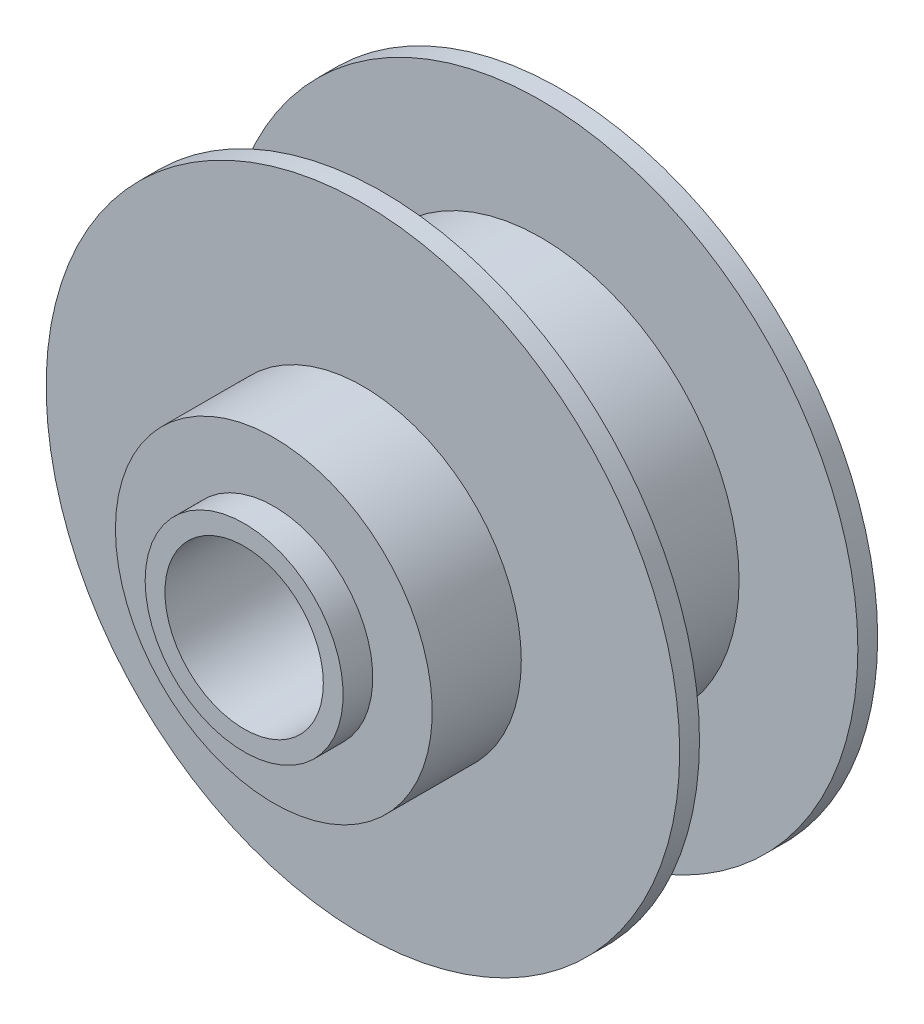
ISO-10303-21;
HEADER;
FILE_DESCRIPTION(('STEP AP214'),'2;1');
FILE_NAME('part.step','',(''),(''),'','','');
FILE_SCHEMA(('AUTOMOTIVE_DESIGN { 1 0 10303 214 1 1 1 1 }'));
ENDSEC;
DATA;
#1=APPLICATION_CONTEXT('core data for automotive mechanical design processes');
#2=APPLICATION_PROTOCOL_DEFINITION('international standard','automotive_design',2000,#1);
#3=PRODUCT_CONTEXT('',#1,'mechanical');
#4=PRODUCT('Part','Part','',(#3));
#5=PRODUCT_RELATED_PRODUCT_CATEGORY('part','',(#4));
#6=PRODUCT_DEFINITION_FORMATION('','',#4);
#7=PRODUCT_DEFINITION_CONTEXT('part definition',#1,'design');
#8=PRODUCT_DEFINITION('design','',#6,#7);
#9=PRODUCT_DEFINITION_SHAPE('','',#8);
#10=(LENGTH_UNIT() NAMED_UNIT(*) SI_UNIT(.MILLI.,.METRE.));
#11=(NAMED_UNIT(*) PLANE_ANGLE_UNIT() SI_UNIT($,.RADIAN.));
#12=(NAMED_UNIT(*) SI_UNIT($,.STERADIAN.) SOLID_ANGLE_UNIT());
#13=UNCERTAINTY_MEASURE_WITH_UNIT(LENGTH_MEASURE(1.E-05),#10,'distance_accuracy_value','');
#14=(GEOMETRIC_REPRESENTATION_CONTEXT(3) GLOBAL_UNCERTAINTY_ASSIGNED_CONTEXT((#13)) GLOBAL_UNIT_ASSIGNED_CONTEXT((#10,
#11,#12)) REPRESENTATION_CONTEXT('',''));
#15=CARTESIAN_POINT('',(0.,0.,0.));
#16=DIRECTION('',(0.,0.,1.));
#17=DIRECTION('',(1.,0.,0.));
#18=AXIS2_PLACEMENT_3D('',#15,#16,#17);
#19=CARTESIAN_POINT('',(0.,0.,10.));
#20=DIRECTION('',(0.,0.,-1.));
#21=DIRECTION('',(-1.,0.,0.));
#22=AXIS2_PLACEMENT_3D('',#19,#20,#21);
#23=CYLINDRICAL_SURFACE('',#22,16.);
#24=CARTESIAN_POINT('',(0.,0.,10.));
#25=DIRECTION('',(0.,0.,1.));
#26=DIRECTION('',(1.,0.,0.));
#27=AXIS2_PLACEMENT_3D('',#24,#25,#26);
#28=CIRCLE('',#27,16.);
#29=CARTESIAN_POINT('',(16.,0.,10.));
#30=VERTEX_POINT('',#29);
#31=EDGE_CURVE('E39',#30,#30,#28,.T.);
#32=ORIENTED_EDGE('',*,*,#31,.F.);
#33=EDGE_LOOP('',(#32));
#34=FACE_BOUND('',#33,.T.);
#35=CARTESIAN_POINT('',(0.,0.,9.));
#36=DIRECTION('',(0.,0.,1.));
#37=DIRECTION('',(1.,0.,0.));
#38=AXIS2_PLACEMENT_3D('',#35,#36,#37);
#39=CIRCLE('',#38,16.);
#40=CARTESIAN_POINT('',(16.,0.,9.));
#41=VERTEX_POINT('',#40);
#42=EDGE_CURVE('E60',#41,#41,#39,.T.);
#43=ORIENTED_EDGE('',*,*,#42,.T.);
#44=EDGE_LOOP('',(#43));
#45=FACE_BOUND('',#44,.T.);
#46=ADVANCED_FACE('F32',(#34,#45),#23,.T.);
#47=CARTESIAN_POINT('',(0.,0.,0.));
#48=DIRECTION('',(0.,0.,1.));
#49=DIRECTION('',(1.,0.,0.));
#50=AXIS2_PLACEMENT_3D('',#47,#48,#49);
#51=CIRCLE('',#50,16.);
#52=CARTESIAN_POINT('',(16.,0.,0.));
#53=VERTEX_POINT('',#52);
#54=EDGE_CURVE('E35',#53,#53,#51,.T.);
#55=ORIENTED_EDGE('',*,*,#54,.T.);
#56=EDGE_LOOP('',(#55));
#57=FACE_BOUND('',#56,.T.);
#58=CARTESIAN_POINT('',(0.,0.,1.));
#59=DIRECTION('',(0.,0.,1.));
#60=DIRECTION('',(1.,0.,0.));
#61=AXIS2_PLACEMENT_3D('',#58,#59,#60);
#62=CIRCLE('',#61,16.);
#63=CARTESIAN_POINT('',(16.,0.,1.));
#64=VERTEX_POINT('',#63);
#65=EDGE_CURVE('E57',#64,#64,#62,.T.);
#66=ORIENTED_EDGE('',*,*,#65,.F.);
#67=EDGE_LOOP('',(#66));
#68=FACE_BOUND('',#67,.T.);
#69=ADVANCED_FACE('F108',(#57,#68),#23,.T.);
#70=CARTESIAN_POINT('',(0.,0.,10.));
#71=DIRECTION('',(0.,0.,1.));
#72=DIRECTION('',(1.,0.,0.));
#73=AXIS2_PLACEMENT_3D('',#70,#71,#72);
#74=PLANE('',#73);
#75=CARTESIAN_POINT('',(0.,0.,10.));
#76=DIRECTION('',(0.,0.,1.));
#77=DIRECTION('',(1.,0.,0.));
#78=AXIS2_PLACEMENT_3D('',#75,#76,#77);
#79=CIRCLE('',#78,8.);
#80=CARTESIAN_POINT('',(8.,0.,10.));
#81=VERTEX_POINT('',#80);
#82=EDGE_CURVE('E10',#81,#81,#79,.T.);
#83=ORIENTED_EDGE('',*,*,#82,.F.);
#84=EDGE_LOOP('',(#83));
#85=FACE_BOUND('',#84,.T.);
#86=ORIENTED_EDGE('',*,*,#31,.T.);
#87=EDGE_LOOP('',(#86));
#88=FACE_BOUND('',#87,.T.);
#89=ADVANCED_FACE('F113',(#85,#88),#74,.T.);
#90=CARTESIAN_POINT('',(0.,0.,0.));
#91=DIRECTION('',(0.,0.,1.));
#92=DIRECTION('',(1.,0.,0.));
#93=AXIS2_PLACEMENT_3D('',#90,#91,#92);
#94=PLANE('',#93);
#95=CARTESIAN_POINT('',(0.,0.,0.));
#96=DIRECTION('',(0.,0.,1.));
#97=DIRECTION('',(1.,0.,0.));
#98=AXIS2_PLACEMENT_3D('',#95,#96,#97);
#99=CIRCLE('',#98,4.);
#100=CARTESIAN_POINT('',(4.,0.,0.));
#101=VERTEX_POINT('',#100);
#102=EDGE_CURVE('E48',#101,#101,#99,.T.);
#103=ORIENTED_EDGE('',*,*,#102,.T.);
#104=EDGE_LOOP('',(#103));
#105=FACE_BOUND('',#104,.T.);
#106=ORIENTED_EDGE('',*,*,#54,.F.);
#107=EDGE_LOOP('',(#106));
#108=FACE_BOUND('',#107,.T.);
#109=ADVANCED_FACE('F121',(#105,#108),#94,.F.);
#110=CARTESIAN_POINT('',(0.,0.,16.));
#111=DIRECTION('',(0.,0.,-1.));
#112=DIRECTION('',(-1.,0.,0.));
#113=AXIS2_PLACEMENT_3D('',#110,#111,#112);
#114=CYLINDRICAL_SURFACE('',#113,8.);
#115=CARTESIAN_POINT('',(0.,0.,14.5));
#116=DIRECTION('',(0.,0.,-1.));
#117=DIRECTION('',(-1.,0.,0.));
#118=AXIS2_PLACEMENT_3D('',#115,#116,#117);
#119=CIRCLE('',#118,8.);
#120=CARTESIAN_POINT('',(-8.,0.,14.5));
#121=VERTEX_POINT('',#120);
#122=EDGE_CURVE('E69',#121,#121,#119,.T.);
#123=ORIENTED_EDGE('',*,*,#122,.T.);
#124=EDGE_LOOP('',(#123));
#125=FACE_BOUND('',#124,.T.);
#126=ORIENTED_EDGE('',*,*,#82,.T.);
#127=EDGE_LOOP('',(#126));
#128=FACE_BOUND('',#127,.T.);
#129=ADVANCED_FACE('F73',(#125,#128),#114,.T.);
#130=CARTESIAN_POINT('',(0.,0.,16.));
#131=DIRECTION('',(0.,0.,1.));
#132=DIRECTION('',(1.,0.,0.));
#133=AXIS2_PLACEMENT_3D('',#130,#131,#132);
#134=PLANE('',#133);
#135=CARTESIAN_POINT('',(0.,0.,16.));
#136=DIRECTION('',(0.,0.,-1.));
#137=DIRECTION('',(-1.,0.,0.));
#138=AXIS2_PLACEMENT_3D('',#135,#136,#137);
#139=CIRCLE('',#138,5.);
#140=CARTESIAN_POINT('',(-5.,0.,16.));
#141=VERTEX_POINT('',#140);
#142=EDGE_CURVE('E63',#141,#141,#139,.T.);
#143=ORIENTED_EDGE('',*,*,#142,.F.);
#144=EDGE_LOOP('',(#143));
#145=FACE_BOUND('',#144,.T.);
#146=CARTESIAN_POINT('',(0.,0.,16.));
#147=DIRECTION('',(0.,0.,1.));
#148=DIRECTION('',(1.,0.,0.));
#149=AXIS2_PLACEMENT_3D('',#146,#147,#148);
#150=CIRCLE('',#149,4.);
#151=CARTESIAN_POINT('',(4.,0.,16.));
#152=VERTEX_POINT('',#151);
#153=EDGE_CURVE('E45',#152,#152,#150,.T.);
#154=ORIENTED_EDGE('',*,*,#153,.F.);
#155=EDGE_LOOP('',(#154));
#156=FACE_BOUND('',#155,.T.);
#157=ADVANCED_FACE('F88',(#145,#156),#134,.T.);
#158=CARTESIAN_POINT('',(0.,0.,0.));
#159=DIRECTION('',(0.,0.,1.));
#160=DIRECTION('',(1.,0.,0.));
#161=AXIS2_PLACEMENT_3D('',#158,#159,#160);
#162=CYLINDRICAL_SURFACE('',#161,4.);
#163=ORIENTED_EDGE('',*,*,#102,.F.);
#164=EDGE_LOOP('',(#163));
#165=FACE_BOUND('',#164,.T.);
#166=ORIENTED_EDGE('',*,*,#153,.T.);
#167=EDGE_LOOP('',(#166));
#168=FACE_BOUND('',#167,.T.);
#169=ADVANCED_FACE('F91',(#165,#168),#162,.F.);
#170=CARTESIAN_POINT('',(0.,16.,9.));
#171=DIRECTION('',(0.,0.,-1.));
#172=DIRECTION('',(-1.,0.,0.));
#173=AXIS2_PLACEMENT_3D('',#170,#171,#172);
#174=PLANE('',#173);
#175=CARTESIAN_POINT('',(0.,0.,9.));
#176=DIRECTION('',(0.,0.,1.));
#177=DIRECTION('',(1.,0.,0.));
#178=AXIS2_PLACEMENT_3D('',#175,#176,#177);
#179=CIRCLE('',#178,10.);
#180=CARTESIAN_POINT('',(10.,0.,9.));
#181=VERTEX_POINT('',#180);
#182=EDGE_CURVE('E49',#181,#181,#179,.T.);
#183=ORIENTED_EDGE('',*,*,#182,.T.);
#184=EDGE_LOOP('',(#183));
#185=FACE_BOUND('',#184,.T.);
#186=ORIENTED_EDGE('',*,*,#42,.F.);
#187=EDGE_LOOP('',(#186));
#188=FACE_BOUND('',#187,.T.);
#189=ADVANCED_FACE('F96',(#185,#188),#174,.T.);
#190=CARTESIAN_POINT('',(0.,0.,0.));
#191=DIRECTION('',(0.,0.,1.));
#192=DIRECTION('',(1.,0.,0.));
#193=AXIS2_PLACEMENT_3D('',#190,#191,#192);
#194=CYLINDRICAL_SURFACE('',#193,10.);
#195=CARTESIAN_POINT('',(0.,0.,0.999999999999999));
#196=DIRECTION('',(0.,0.,1.));
#197=DIRECTION('',(1.,0.,0.));
#198=AXIS2_PLACEMENT_3D('',#195,#196,#197);
#199=CIRCLE('',#198,10.);
#200=CARTESIAN_POINT('',(10.,0.,0.999999999999999));
#201=VERTEX_POINT('',#200);
#202=EDGE_CURVE('E54',#201,#201,#199,.T.);
#203=ORIENTED_EDGE('',*,*,#202,.T.);
#204=EDGE_LOOP('',(#203));
#205=FACE_BOUND('',#204,.T.);
#206=ORIENTED_EDGE('',*,*,#182,.F.);
#207=EDGE_LOOP('',(#206));
#208=FACE_BOUND('',#207,.T.);
#209=ADVANCED_FACE('F103',(#205,#208),#194,.T.);
#210=CARTESIAN_POINT('',(0.,16.,1.));
#211=DIRECTION('',(0.,0.,1.));
#212=DIRECTION('',(1.,0.,0.));
#213=AXIS2_PLACEMENT_3D('',#210,#211,#212);
#214=PLANE('',#213);
#215=ORIENTED_EDGE('',*,*,#65,.T.);
#216=EDGE_LOOP('',(#215));
#217=FACE_BOUND('',#216,.T.);
#218=ORIENTED_EDGE('',*,*,#202,.F.);
#219=EDGE_LOOP('',(#218));
#220=FACE_BOUND('',#219,.T.);
#221=ADVANCED_FACE('F84',(#217,#220),#214,.T.);
#222=CARTESIAN_POINT('',(0.,0.,0.));
#223=DIRECTION('',(0.,0.,-1.));
#224=DIRECTION('',(-1.,0.,0.));
#225=AXIS2_PLACEMENT_3D('',#222,#223,#224);
#226=CYLINDRICAL_SURFACE('',#225,5.);
#227=CARTESIAN_POINT('',(0.,0.,14.5));
#228=DIRECTION('',(0.,0.,-1.));
#229=DIRECTION('',(-1.,0.,0.));
#230=AXIS2_PLACEMENT_3D('',#227,#228,#229);
#231=CIRCLE('',#230,5.);
#232=CARTESIAN_POINT('',(-5.,0.,14.5));
#233=VERTEX_POINT('',#232);
#234=EDGE_CURVE('E66',#233,#233,#231,.T.);
#235=ORIENTED_EDGE('',*,*,#234,.F.);
#236=EDGE_LOOP('',(#235));
#237=FACE_BOUND('',#236,.T.);
#238=ORIENTED_EDGE('',*,*,#142,.T.);
#239=EDGE_LOOP('',(#238));
#240=FACE_BOUND('',#239,.T.);
#241=ADVANCED_FACE('F78',(#237,#240),#226,.T.);
#242=CARTESIAN_POINT('',(0.,8.,14.5));
#243=DIRECTION('',(0.,0.,-1.));
#244=DIRECTION('',(-1.,0.,0.));
#245=AXIS2_PLACEMENT_3D('',#242,#243,#244);
#246=PLANE('',#245);
#247=ORIENTED_EDGE('',*,*,#122,.F.);
#248=EDGE_LOOP('',(#247));
#249=FACE_BOUND('',#248,.T.);
#250=ORIENTED_EDGE('',*,*,#234,.T.);
#251=EDGE_LOOP('',(#250));
#252=FACE_BOUND('',#251,.T.);
#253=ADVANCED_FACE('F75',(#249,#252),#246,.F.);
#254=CLOSED_SHELL('',(#46,#69,#89,#109,#129,#157,#169,#189,#209,#221,#241,#253));
#255=MANIFOLD_SOLID_BREP('B2',#254);
#256=ADVANCED_BREP_SHAPE_REPRESENTATION('',(#18,#255),#14);
#257=SHAPE_DEFINITION_REPRESENTATION(#9,#256);
ENDSEC;
END-ISO-10303-21;
